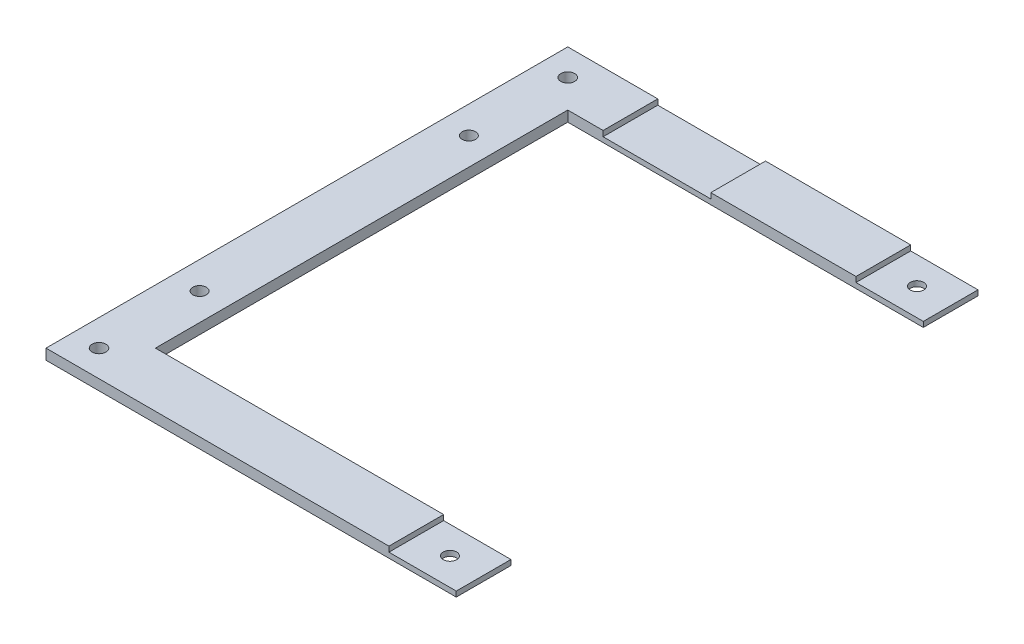
ISO-10303-21;
HEADER;
FILE_DESCRIPTION(('STEP AP214'),'2;1');
FILE_NAME('part.step','',(''),(''),'','','');
FILE_SCHEMA(('AUTOMOTIVE_DESIGN { 1 0 10303 214 1 1 1 1 }'));
ENDSEC;
DATA;
#1=APPLICATION_CONTEXT('core data for automotive mechanical design processes');
#2=APPLICATION_PROTOCOL_DEFINITION('international standard','automotive_design',2000,#1);
#3=PRODUCT_CONTEXT('',#1,'mechanical');
#4=PRODUCT('Part','Part','',(#3));
#5=PRODUCT_RELATED_PRODUCT_CATEGORY('part','',(#4));
#6=PRODUCT_DEFINITION_FORMATION('','',#4);
#7=PRODUCT_DEFINITION_CONTEXT('part definition',#1,'design');
#8=PRODUCT_DEFINITION('design','',#6,#7);
#9=PRODUCT_DEFINITION_SHAPE('','',#8);
#10=(LENGTH_UNIT() NAMED_UNIT(*) SI_UNIT(.MILLI.,.METRE.));
#11=(NAMED_UNIT(*) PLANE_ANGLE_UNIT() SI_UNIT($,.RADIAN.));
#12=(NAMED_UNIT(*) SI_UNIT($,.STERADIAN.) SOLID_ANGLE_UNIT());
#13=UNCERTAINTY_MEASURE_WITH_UNIT(LENGTH_MEASURE(1.E-05),#10,'distance_accuracy_value','');
#14=(GEOMETRIC_REPRESENTATION_CONTEXT(3) GLOBAL_UNCERTAINTY_ASSIGNED_CONTEXT((#13)) GLOBAL_UNIT_ASSIGNED_CONTEXT((#10,
#11,#12)) REPRESENTATION_CONTEXT('',''));
#15=CARTESIAN_POINT('',(0.,0.,0.));
#16=DIRECTION('',(0.,0.,1.));
#17=DIRECTION('',(1.,0.,0.));
#18=AXIS2_PLACEMENT_3D('',#15,#16,#17);
#19=CARTESIAN_POINT('',(-12.7,0.,-98.435));
#20=DIRECTION('',(-1.,0.,0.));
#21=DIRECTION('',(0.,-1.,0.));
#22=AXIS2_PLACEMENT_3D('',#19,#20,#21);
#23=PLANE('',#22);
#24=DIRECTION('',(0.,0.,1.));
#25=VECTOR('',#24,1.);
#26=CARTESIAN_POINT('',(-12.7,0.,0.));
#27=LINE('',#26,#25);
#28=CARTESIAN_POINT('',(-12.7,0.,77.7875));
#29=VERTEX_POINT('',#28);
#30=CARTESIAN_POINT('',(-12.7,0.,98.425));
#31=VERTEX_POINT('',#30);
#32=EDGE_CURVE('E238',#29,#31,#27,.T.);
#33=ORIENTED_EDGE('',*,*,#32,.T.);
#34=DIRECTION('',(0.,-1.,0.));
#35=VECTOR('',#34,1.);
#36=CARTESIAN_POINT('',(-12.7,-3.96875000000068,98.425));
#37=LINE('',#36,#35);
#38=CARTESIAN_POINT('',(-12.7,-1.984375,98.425));
#39=VERTEX_POINT('',#38);
#40=EDGE_CURVE('E253',#31,#39,#37,.T.);
#41=ORIENTED_EDGE('',*,*,#40,.T.);
#42=DIRECTION('',(0.,0.,1.));
#43=VECTOR('',#42,1.);
#44=CARTESIAN_POINT('',(-12.7,-1.984375,-98.435));
#45=LINE('',#44,#43);
#46=CARTESIAN_POINT('',(-12.7,-1.984375,77.7875));
#47=VERTEX_POINT('',#46);
#48=EDGE_CURVE('E255',#47,#39,#45,.T.);
#49=ORIENTED_EDGE('',*,*,#48,.F.);
#50=DIRECTION('',(0.,-1.,0.));
#51=VECTOR('',#50,1.);
#52=CARTESIAN_POINT('',(-12.7,-3.96875000000057,77.7875));
#53=LINE('',#52,#51);
#54=EDGE_CURVE('E246',#29,#47,#53,.T.);
#55=ORIENTED_EDGE('',*,*,#54,.F.);
#56=EDGE_LOOP('',(#33,#41,#49,#55));
#57=FACE_BOUND('',#56,.T.);
#58=ADVANCED_FACE('F34',(#57),#23,.F.);
#59=CARTESIAN_POINT('',(12.7,-1.984375,-98.435));
#60=DIRECTION('',(-1.,0.,0.));
#61=DIRECTION('',(0.,-1.,0.));
#62=AXIS2_PLACEMENT_3D('',#59,#60,#61);
#63=PLANE('',#62);
#64=DIRECTION('',(0.,0.,1.));
#65=VECTOR('',#64,1.);
#66=CARTESIAN_POINT('',(12.7,-1.984375,-98.435));
#67=LINE('',#66,#65);
#68=CARTESIAN_POINT('',(12.7,-1.984375,77.7875));
#69=VERTEX_POINT('',#68);
#70=CARTESIAN_POINT('',(12.7,-1.984375,98.425));
#71=VERTEX_POINT('',#70);
#72=EDGE_CURVE('E12',#69,#71,#67,.T.);
#73=ORIENTED_EDGE('',*,*,#72,.T.);
#74=DIRECTION('',(0.,-1.,0.));
#75=VECTOR('',#74,1.);
#76=CARTESIAN_POINT('',(12.7,-3.96875000000081,98.425));
#77=LINE('',#76,#75);
#78=CARTESIAN_POINT('',(12.6999999999999,-3.96875,98.425));
#79=VERTEX_POINT('',#78);
#80=EDGE_CURVE('E247',#71,#79,#77,.T.);
#81=ORIENTED_EDGE('',*,*,#80,.T.);
#82=DIRECTION('',(0.,0.,1.));
#83=VECTOR('',#82,1.);
#84=CARTESIAN_POINT('',(12.7,-3.96875,0.));
#85=LINE('',#84,#83);
#86=CARTESIAN_POINT('',(12.7,-3.96875,77.7875));
#87=VERTEX_POINT('',#86);
#88=EDGE_CURVE('E243',#87,#79,#85,.T.);
#89=ORIENTED_EDGE('',*,*,#88,.F.);
#90=DIRECTION('',(0.,-1.,0.));
#91=VECTOR('',#90,1.);
#92=CARTESIAN_POINT('',(12.7,-3.9687500000007,77.7875));
#93=LINE('',#92,#91);
#94=EDGE_CURVE('E237',#69,#87,#93,.T.);
#95=ORIENTED_EDGE('',*,*,#94,.F.);
#96=EDGE_LOOP('',(#73,#81,#89,#95));
#97=FACE_BOUND('',#96,.T.);
#98=ADVANCED_FACE('F286',(#97),#63,.F.);
#99=CARTESIAN_POINT('',(-12.7,-1.984375,-98.435));
#100=DIRECTION('',(0.,-1.,0.));
#101=DIRECTION('',(1.,0.,0.));
#102=AXIS2_PLACEMENT_3D('',#99,#100,#101);
#103=PLANE('',#102);
#104=CARTESIAN_POINT('',(0.,-1.984375,88.10625));
#105=DIRECTION('',(0.,-1.,0.));
#106=DIRECTION('',(1.,0.,0.));
#107=AXIS2_PLACEMENT_3D('',#104,#105,#106);
#108=CIRCLE('',#107,2.5273);
#109=CARTESIAN_POINT('',(2.52729999999998,-1.984375,88.10625));
#110=VERTEX_POINT('',#109);
#111=EDGE_CURVE('E232',#110,#110,#108,.F.);
#112=ORIENTED_EDGE('',*,*,#111,.F.);
#113=EDGE_LOOP('',(#112));
#114=FACE_BOUND('',#113,.T.);
#115=ORIENTED_EDGE('',*,*,#48,.T.);
#116=DIRECTION('',(1.,0.,0.));
#117=VECTOR('',#116,1.);
#118=CARTESIAN_POINT('',(-142.08125,-1.98437500000002,98.425));
#119=LINE('',#118,#117);
#120=EDGE_CURVE('E250',#39,#71,#119,.T.);
#121=ORIENTED_EDGE('',*,*,#120,.T.);
#122=ORIENTED_EDGE('',*,*,#72,.F.);
#123=DIRECTION('',(1.,0.,0.));
#124=VECTOR('',#123,1.);
#125=CARTESIAN_POINT('',(-121.44375,-1.98437500000001,77.7875));
#126=LINE('',#125,#124);
#127=EDGE_CURVE('E261',#47,#69,#126,.T.);
#128=ORIENTED_EDGE('',*,*,#127,.F.);
#129=EDGE_LOOP('',(#115,#121,#122,#128));
#130=FACE_BOUND('',#129,.T.);
#131=ADVANCED_FACE('F278',(#114,#130),#103,.F.);
#132=DIRECTION('',(-1.,0.,0.));
#133=VECTOR('',#132,1.);
#134=CARTESIAN_POINT('',(142.08125,-1.98437499999998,-98.425));
#135=LINE('',#134,#133);
#136=CARTESIAN_POINT('',(12.7,-1.984375,-98.425));
#137=VERTEX_POINT('',#136);
#138=CARTESIAN_POINT('',(-12.7,-1.984375,-98.425));
#139=VERTEX_POINT('',#138);
#140=EDGE_CURVE('E264',#137,#139,#135,.T.);
#141=ORIENTED_EDGE('',*,*,#140,.T.);
#142=CARTESIAN_POINT('',(-12.7,-1.984375,-77.7875));
#143=VERTEX_POINT('',#142);
#144=EDGE_CURVE('E241',#139,#143,#45,.T.);
#145=ORIENTED_EDGE('',*,*,#144,.T.);
#146=DIRECTION('',(-1.,0.,0.));
#147=VECTOR('',#146,1.);
#148=CARTESIAN_POINT('',(121.44375,-1.98437499999998,-77.7875));
#149=LINE('',#148,#147);
#150=CARTESIAN_POINT('',(12.7,-1.984375,-77.7875));
#151=VERTEX_POINT('',#150);
#152=EDGE_CURVE('E50',#151,#143,#149,.T.);
#153=ORIENTED_EDGE('',*,*,#152,.F.);
#154=EDGE_CURVE('E42',#137,#151,#67,.T.);
#155=ORIENTED_EDGE('',*,*,#154,.F.);
#156=EDGE_LOOP('',(#141,#145,#153,#155));
#157=FACE_BOUND('',#156,.T.);
#158=CARTESIAN_POINT('',(0.,-1.984375,-88.10625));
#159=DIRECTION('',(0.,-1.,0.));
#160=DIRECTION('',(1.,0.,0.));
#161=AXIS2_PLACEMENT_3D('',#158,#159,#160);
#162=CIRCLE('',#161,2.5273);
#163=CARTESIAN_POINT('',(2.52729999999996,-1.984375,-88.10625));
#164=VERTEX_POINT('',#163);
#165=EDGE_CURVE('E224',#164,#164,#162,.F.);
#166=ORIENTED_EDGE('',*,*,#165,.F.);
#167=EDGE_LOOP('',(#166));
#168=FACE_BOUND('',#167,.T.);
#169=ADVANCED_FACE('F377',(#157,#168),#103,.F.);
#170=DIRECTION('',(0.,1.,0.));
#171=VECTOR('',#170,1.);
#172=CARTESIAN_POINT('',(12.7,-3.96874999999932,-98.425));
#173=LINE('',#172,#171);
#174=CARTESIAN_POINT('',(12.7,-3.96875,-98.425));
#175=VERTEX_POINT('',#174);
#176=EDGE_CURVE('E266',#175,#137,#173,.T.);
#177=ORIENTED_EDGE('',*,*,#176,.T.);
#178=ORIENTED_EDGE('',*,*,#154,.T.);
#179=DIRECTION('',(0.,1.,0.));
#180=VECTOR('',#179,1.);
#181=CARTESIAN_POINT('',(12.7,-3.96874999999943,-77.7875));
#182=LINE('',#181,#180);
#183=CARTESIAN_POINT('',(12.7,-3.96875,-77.7875));
#184=VERTEX_POINT('',#183);
#185=EDGE_CURVE('E233',#184,#151,#182,.T.);
#186=ORIENTED_EDGE('',*,*,#185,.F.);
#187=EDGE_CURVE('E245',#175,#184,#85,.T.);
#188=ORIENTED_EDGE('',*,*,#187,.F.);
#189=EDGE_LOOP('',(#177,#178,#186,#188));
#190=FACE_BOUND('',#189,.T.);
#191=ADVANCED_FACE('F310',(#190),#63,.F.);
#192=DIRECTION('',(0.,1.,0.));
#193=VECTOR('',#192,1.);
#194=CARTESIAN_POINT('',(-12.7,-3.96874999999919,-98.425));
#195=LINE('',#194,#193);
#196=CARTESIAN_POINT('',(-12.6999999999999,0.,-98.425));
#197=VERTEX_POINT('',#196);
#198=EDGE_CURVE('E37',#139,#197,#195,.T.);
#199=ORIENTED_EDGE('',*,*,#198,.T.);
#200=CARTESIAN_POINT('',(-12.7,0.,-77.7875));
#201=VERTEX_POINT('',#200);
#202=EDGE_CURVE('E242',#197,#201,#27,.T.);
#203=ORIENTED_EDGE('',*,*,#202,.T.);
#204=DIRECTION('',(0.,1.,0.));
#205=VECTOR('',#204,1.);
#206=CARTESIAN_POINT('',(-12.7,-3.9687499999993,-77.7875));
#207=LINE('',#206,#205);
#208=EDGE_CURVE('E235',#143,#201,#207,.T.);
#209=ORIENTED_EDGE('',*,*,#208,.F.);
#210=ORIENTED_EDGE('',*,*,#144,.F.);
#211=EDGE_LOOP('',(#199,#203,#209,#210));
#212=FACE_BOUND('',#211,.T.);
#213=ADVANCED_FACE('F363',(#212),#23,.F.);
#214=CARTESIAN_POINT('',(-131.7625,0.,-50.8));
#215=DIRECTION('',(0.,1.,0.));
#216=DIRECTION('',(0.,0.,1.));
#217=AXIS2_PLACEMENT_3D('',#214,#215,#216);
#218=CYLINDRICAL_SURFACE('',#217,2.52730000000001);
#219=CARTESIAN_POINT('',(-131.7625,-3.96875,-50.8));
#220=DIRECTION('',(0.,1.,0.));
#221=DIRECTION('',(0.,0.,1.));
#222=AXIS2_PLACEMENT_3D('',#219,#220,#221);
#223=CIRCLE('',#222,2.52730000000001);
#224=CARTESIAN_POINT('',(-131.7625,-3.96875,-48.2727));
#225=VERTEX_POINT('',#224);
#226=EDGE_CURVE('E166',#225,#225,#223,.T.);
#227=ORIENTED_EDGE('',*,*,#226,.F.);
#228=EDGE_LOOP('',(#227));
#229=FACE_BOUND('',#228,.T.);
#230=CARTESIAN_POINT('',(-131.7625,0.,-50.8));
#231=DIRECTION('',(0.,1.,0.));
#232=DIRECTION('',(0.,0.,1.));
#233=AXIS2_PLACEMENT_3D('',#230,#231,#232);
#234=CIRCLE('',#233,2.52730000000001);
#235=CARTESIAN_POINT('',(-131.7625,0.,-48.2727));
#236=VERTEX_POINT('',#235);
#237=EDGE_CURVE('E324',#236,#236,#234,.T.);
#238=ORIENTED_EDGE('',*,*,#237,.T.);
#239=EDGE_LOOP('',(#238));
#240=FACE_BOUND('',#239,.T.);
#241=ADVANCED_FACE('F369',(#229,#240),#218,.F.);
#242=CARTESIAN_POINT('',(-131.7625,0.,50.8));
#243=DIRECTION('',(0.,1.,0.));
#244=DIRECTION('',(0.,0.,1.));
#245=AXIS2_PLACEMENT_3D('',#242,#243,#244);
#246=CYLINDRICAL_SURFACE('',#245,2.52730000000001);
#247=CARTESIAN_POINT('',(-131.7625,-3.96875,50.8));
#248=DIRECTION('',(0.,1.,0.));
#249=DIRECTION('',(0.,0.,1.));
#250=AXIS2_PLACEMENT_3D('',#247,#248,#249);
#251=CIRCLE('',#250,2.52730000000001);
#252=CARTESIAN_POINT('',(-131.7625,-3.96875,53.3273));
#253=VERTEX_POINT('',#252);
#254=EDGE_CURVE('E327',#253,#253,#251,.T.);
#255=ORIENTED_EDGE('',*,*,#254,.F.);
#256=EDGE_LOOP('',(#255));
#257=FACE_BOUND('',#256,.T.);
#258=CARTESIAN_POINT('',(-131.7625,0.,50.8));
#259=DIRECTION('',(0.,1.,0.));
#260=DIRECTION('',(0.,0.,1.));
#261=AXIS2_PLACEMENT_3D('',#258,#259,#260);
#262=CIRCLE('',#261,2.52730000000001);
#263=CARTESIAN_POINT('',(-131.7625,0.,53.3273));
#264=VERTEX_POINT('',#263);
#265=EDGE_CURVE('E330',#264,#264,#262,.T.);
#266=ORIENTED_EDGE('',*,*,#265,.T.);
#267=EDGE_LOOP('',(#266));
#268=FACE_BOUND('',#267,.T.);
#269=ADVANCED_FACE('F359',(#257,#268),#246,.F.);
#270=CARTESIAN_POINT('',(-132.08125,4.4196,88.425));
#271=DIRECTION('',(0.,1.,0.));
#272=DIRECTION('',(0.,0.,1.));
#273=AXIS2_PLACEMENT_3D('',#270,#271,#272);
#274=CYLINDRICAL_SURFACE('',#273,2.60985);
#275=CARTESIAN_POINT('',(-132.08125,0.,88.425));
#276=DIRECTION('',(0.,1.,0.));
#277=DIRECTION('',(0.,0.,1.));
#278=AXIS2_PLACEMENT_3D('',#275,#276,#277);
#279=CIRCLE('',#278,2.60985);
#280=CARTESIAN_POINT('',(-132.08125,0.,91.03485));
#281=VERTEX_POINT('',#280);
#282=EDGE_CURVE('E339',#281,#281,#279,.T.);
#283=ORIENTED_EDGE('',*,*,#282,.T.);
#284=EDGE_LOOP('',(#283));
#285=FACE_BOUND('',#284,.T.);
#286=CARTESIAN_POINT('',(-132.08125,-3.96875,88.425));
#287=DIRECTION('',(0.,1.,0.));
#288=DIRECTION('',(0.,0.,1.));
#289=AXIS2_PLACEMENT_3D('',#286,#287,#288);
#290=CIRCLE('',#289,2.60985);
#291=CARTESIAN_POINT('',(-132.08125,-3.96875,91.03485));
#292=VERTEX_POINT('',#291);
#293=EDGE_CURVE('E228',#292,#292,#290,.T.);
#294=ORIENTED_EDGE('',*,*,#293,.F.);
#295=EDGE_LOOP('',(#294));
#296=FACE_BOUND('',#295,.T.);
#297=ADVANCED_FACE('F351',(#285,#296),#274,.F.);
#298=CARTESIAN_POINT('',(-132.08125,4.4196,-88.425));
#299=DIRECTION('',(0.,1.,0.));
#300=DIRECTION('',(0.,0.,1.));
#301=AXIS2_PLACEMENT_3D('',#298,#299,#300);
#302=CYLINDRICAL_SURFACE('',#301,2.60985);
#303=CARTESIAN_POINT('',(-132.08125,0.,-88.425));
#304=DIRECTION('',(0.,1.,0.));
#305=DIRECTION('',(0.,0.,1.));
#306=AXIS2_PLACEMENT_3D('',#303,#304,#305);
#307=CIRCLE('',#306,2.60985);
#308=CARTESIAN_POINT('',(-132.08125,0.,-85.81515));
#309=VERTEX_POINT('',#308);
#310=EDGE_CURVE('E225',#309,#309,#307,.T.);
#311=ORIENTED_EDGE('',*,*,#310,.T.);
#312=EDGE_LOOP('',(#311));
#313=FACE_BOUND('',#312,.T.);
#314=CARTESIAN_POINT('',(-132.08125,-3.96875,-88.425));
#315=DIRECTION('',(0.,1.,0.));
#316=DIRECTION('',(0.,0.,1.));
#317=AXIS2_PLACEMENT_3D('',#314,#315,#316);
#318=CIRCLE('',#317,2.60985);
#319=CARTESIAN_POINT('',(-132.08125,-3.96875,-85.81515));
#320=VERTEX_POINT('',#319);
#321=EDGE_CURVE('E229',#320,#320,#318,.T.);
#322=ORIENTED_EDGE('',*,*,#321,.F.);
#323=EDGE_LOOP('',(#322));
#324=FACE_BOUND('',#323,.T.);
#325=ADVANCED_FACE('F349',(#313,#324),#302,.F.);
#326=CARTESIAN_POINT('',(-142.08125,-3.96875,98.425));
#327=DIRECTION('',(0.,0.,1.));
#328=DIRECTION('',(1.,0.,0.));
#329=AXIS2_PLACEMENT_3D('',#326,#327,#328);
#330=PLANE('',#329);
#331=ORIENTED_EDGE('',*,*,#40,.F.);
#332=DIRECTION('',(1.,0.,0.));
#333=VECTOR('',#332,1.);
#334=CARTESIAN_POINT('',(-142.08125,0.,98.425));
#335=LINE('',#334,#333);
#336=CARTESIAN_POINT('',(-142.08125,0.,98.425));
#337=VERTEX_POINT('',#336);
#338=EDGE_CURVE('E202',#337,#31,#335,.T.);
#339=ORIENTED_EDGE('',*,*,#338,.F.);
#340=DIRECTION('',(0.,1.,0.));
#341=VECTOR('',#340,1.);
#342=CARTESIAN_POINT('',(-142.08125,-3.96875,98.425));
#343=LINE('',#342,#341);
#344=CARTESIAN_POINT('',(-142.08125,-3.96875,98.425));
#345=VERTEX_POINT('',#344);
#346=EDGE_CURVE('E216',#345,#337,#343,.T.);
#347=ORIENTED_EDGE('',*,*,#346,.F.);
#348=DIRECTION('',(1.,0.,0.));
#349=VECTOR('',#348,1.);
#350=CARTESIAN_POINT('',(-142.08125,-3.96875,98.425));
#351=LINE('',#350,#349);
#352=EDGE_CURVE('E205',#345,#79,#351,.T.);
#353=ORIENTED_EDGE('',*,*,#352,.T.);
#354=ORIENTED_EDGE('',*,*,#80,.F.);
#355=ORIENTED_EDGE('',*,*,#120,.F.);
#356=EDGE_LOOP('',(#331,#339,#347,#353,#354,#355));
#357=FACE_BOUND('',#356,.T.);
#358=ADVANCED_FACE('F282',(#357),#330,.T.);
#359=CARTESIAN_POINT('',(-142.08125,-3.96875,-98.4249999999999));
#360=DIRECTION('',(-1.,0.,0.));
#361=DIRECTION('',(0.,0.,1.));
#362=AXIS2_PLACEMENT_3D('',#359,#360,#361);
#363=PLANE('',#362);
#364=DIRECTION('',(0.,0.,1.));
#365=VECTOR('',#364,1.);
#366=CARTESIAN_POINT('',(-142.08125,0.,-98.4249999999999));
#367=LINE('',#366,#365);
#368=CARTESIAN_POINT('',(-142.08125,0.,-98.4249999999999));
#369=VERTEX_POINT('',#368);
#370=EDGE_CURVE('E211',#369,#337,#367,.T.);
#371=ORIENTED_EDGE('',*,*,#370,.F.);
#372=DIRECTION('',(0.,1.,0.));
#373=VECTOR('',#372,1.);
#374=CARTESIAN_POINT('',(-142.08125,-3.96875,-98.4249999999999));
#375=LINE('',#374,#373);
#376=CARTESIAN_POINT('',(-142.08125,-3.96875,-98.4249999999999));
#377=VERTEX_POINT('',#376);
#378=EDGE_CURVE('E208',#377,#369,#375,.T.);
#379=ORIENTED_EDGE('',*,*,#378,.F.);
#380=DIRECTION('',(0.,0.,1.));
#381=VECTOR('',#380,1.);
#382=CARTESIAN_POINT('',(-142.08125,-3.96875,-98.4249999999999));
#383=LINE('',#382,#381);
#384=EDGE_CURVE('E201',#377,#345,#383,.T.);
#385=ORIENTED_EDGE('',*,*,#384,.T.);
#386=ORIENTED_EDGE('',*,*,#346,.T.);
#387=EDGE_LOOP('',(#371,#379,#385,#386));
#388=FACE_BOUND('',#387,.T.);
#389=ADVANCED_FACE('F305',(#388),#363,.T.);
#390=CARTESIAN_POINT('',(142.08125,-3.96875,-98.425));
#391=DIRECTION('',(0.,0.,-1.));
#392=DIRECTION('',(-1.,0.,0.));
#393=AXIS2_PLACEMENT_3D('',#390,#391,#392);
#394=PLANE('',#393);
#395=ORIENTED_EDGE('',*,*,#198,.F.);
#396=ORIENTED_EDGE('',*,*,#140,.F.);
#397=ORIENTED_EDGE('',*,*,#176,.F.);
#398=DIRECTION('',(-1.,0.,0.));
#399=VECTOR('',#398,1.);
#400=CARTESIAN_POINT('',(142.08125,-3.96875,-98.425));
#401=LINE('',#400,#399);
#402=EDGE_CURVE('E199',#175,#377,#401,.T.);
#403=ORIENTED_EDGE('',*,*,#402,.T.);
#404=ORIENTED_EDGE('',*,*,#378,.T.);
#405=DIRECTION('',(-1.,0.,0.));
#406=VECTOR('',#405,1.);
#407=CARTESIAN_POINT('',(142.08125,0.,-98.425));
#408=LINE('',#407,#406);
#409=CARTESIAN_POINT('',(-108.10875,0.,-98.425));
#410=VERTEX_POINT('',#409);
#411=EDGE_CURVE('E196',#410,#369,#408,.T.);
#412=ORIENTED_EDGE('',*,*,#411,.F.);
#413=DIRECTION('',(0.,1.,0.));
#414=VECTOR('',#413,1.);
#415=CARTESIAN_POINT('',(-108.10875,-3.96875,-98.4249999999999));
#416=LINE('',#415,#414);
#417=CARTESIAN_POINT('',(-108.10875,-2.06375,-98.425));
#418=VERTEX_POINT('',#417);
#419=EDGE_CURVE('E165',#418,#410,#416,.T.);
#420=ORIENTED_EDGE('',*,*,#419,.F.);
#421=DIRECTION('',(1.,0.,0.));
#422=VECTOR('',#421,1.);
#423=CARTESIAN_POINT('',(-67.46875,-2.06375,-98.425));
#424=LINE('',#423,#422);
#425=CARTESIAN_POINT('',(-67.46875,-2.06375,-98.425));
#426=VERTEX_POINT('',#425);
#427=EDGE_CURVE('E149',#418,#426,#424,.T.);
#428=ORIENTED_EDGE('',*,*,#427,.T.);
#429=DIRECTION('',(0.,-1.,0.));
#430=VECTOR('',#429,1.);
#431=CARTESIAN_POINT('',(-67.46875,-3.96875,-98.425));
#432=LINE('',#431,#430);
#433=CARTESIAN_POINT('',(-67.46875,0.,-98.425));
#434=VERTEX_POINT('',#433);
#435=EDGE_CURVE('E163',#434,#426,#432,.T.);
#436=ORIENTED_EDGE('',*,*,#435,.F.);
#437=EDGE_CURVE('E209',#197,#434,#408,.T.);
#438=ORIENTED_EDGE('',*,*,#437,.F.);
#439=EDGE_LOOP('',(#395,#396,#397,#403,#404,#412,#420,#428,#436,#438));
#440=FACE_BOUND('',#439,.T.);
#441=ADVANCED_FACE('F161',(#440),#394,.T.);
#442=CARTESIAN_POINT('',(0.,-3.96875,0.));
#443=DIRECTION('',(0.,1.,0.));
#444=DIRECTION('',(0.,0.,1.));
#445=AXIS2_PLACEMENT_3D('',#442,#443,#444);
#446=PLANE('',#445);
#447=ORIENTED_EDGE('',*,*,#321,.T.);
#448=EDGE_LOOP('',(#447));
#449=FACE_BOUND('',#448,.T.);
#450=ORIENTED_EDGE('',*,*,#293,.T.);
#451=EDGE_LOOP('',(#450));
#452=FACE_BOUND('',#451,.T.);
#453=CARTESIAN_POINT('',(0.,-3.96875,-88.10625));
#454=DIRECTION('',(0.,1.,0.));
#455=DIRECTION('',(0.,0.,1.));
#456=AXIS2_PLACEMENT_3D('',#453,#454,#455);
#457=CIRCLE('',#456,2.5273);
#458=CARTESIAN_POINT('',(0.,-3.96875,-85.57895));
#459=VERTEX_POINT('',#458);
#460=EDGE_CURVE('E336',#459,#459,#457,.T.);
#461=ORIENTED_EDGE('',*,*,#460,.T.);
#462=EDGE_LOOP('',(#461));
#463=FACE_BOUND('',#462,.T.);
#464=CARTESIAN_POINT('',(0.,-3.96875,88.10625));
#465=DIRECTION('',(0.,1.,0.));
#466=DIRECTION('',(0.,0.,1.));
#467=AXIS2_PLACEMENT_3D('',#464,#465,#466);
#468=CIRCLE('',#467,2.5273);
#469=CARTESIAN_POINT('',(0.,-3.96875,90.63355));
#470=VERTEX_POINT('',#469);
#471=EDGE_CURVE('E333',#470,#470,#468,.T.);
#472=ORIENTED_EDGE('',*,*,#471,.T.);
#473=EDGE_LOOP('',(#472));
#474=FACE_BOUND('',#473,.T.);
#475=ORIENTED_EDGE('',*,*,#254,.T.);
#476=EDGE_LOOP('',(#475));
#477=FACE_BOUND('',#476,.T.);
#478=ORIENTED_EDGE('',*,*,#226,.T.);
#479=EDGE_LOOP('',(#478));
#480=FACE_BOUND('',#479,.T.);
#481=ORIENTED_EDGE('',*,*,#402,.F.);
#482=ORIENTED_EDGE('',*,*,#187,.T.);
#483=DIRECTION('',(-1.,0.,0.));
#484=VECTOR('',#483,1.);
#485=CARTESIAN_POINT('',(121.44375,-3.96875,-77.7875));
#486=LINE('',#485,#484);
#487=CARTESIAN_POINT('',(-121.44375,-3.96875,-77.7875));
#488=VERTEX_POINT('',#487);
#489=EDGE_CURVE('E183',#184,#488,#486,.T.);
#490=ORIENTED_EDGE('',*,*,#489,.T.);
#491=DIRECTION('',(0.,0.,1.));
#492=VECTOR('',#491,1.);
#493=CARTESIAN_POINT('',(-121.44375,-3.96875,-77.7875));
#494=LINE('',#493,#492);
#495=CARTESIAN_POINT('',(-121.44375,-3.96875,77.7875));
#496=VERTEX_POINT('',#495);
#497=EDGE_CURVE('E186',#488,#496,#494,.T.);
#498=ORIENTED_EDGE('',*,*,#497,.T.);
#499=DIRECTION('',(1.,0.,0.));
#500=VECTOR('',#499,1.);
#501=CARTESIAN_POINT('',(-121.44375,-3.96875,77.7875));
#502=LINE('',#501,#500);
#503=EDGE_CURVE('E180',#496,#87,#502,.T.);
#504=ORIENTED_EDGE('',*,*,#503,.T.);
#505=ORIENTED_EDGE('',*,*,#88,.T.);
#506=ORIENTED_EDGE('',*,*,#352,.F.);
#507=ORIENTED_EDGE('',*,*,#384,.F.);
#508=EDGE_LOOP('',(#481,#482,#490,#498,#504,#505,#506,#507));
#509=FACE_BOUND('',#508,.T.);
#510=ADVANCED_FACE('F291',(#449,#452,#463,#474,#477,#480,#509),#446,.F.);
#511=CARTESIAN_POINT('',(0.,0.,-88.10625));
#512=DIRECTION('',(0.,1.,0.));
#513=DIRECTION('',(0.,0.,1.));
#514=AXIS2_PLACEMENT_3D('',#511,#512,#513);
#515=CYLINDRICAL_SURFACE('',#514,2.5273);
#516=ORIENTED_EDGE('',*,*,#165,.T.);
#517=EDGE_LOOP('',(#516));
#518=FACE_BOUND('',#517,.T.);
#519=ORIENTED_EDGE('',*,*,#460,.F.);
#520=EDGE_LOOP('',(#519));
#521=FACE_BOUND('',#520,.T.);
#522=ADVANCED_FACE('F390',(#518,#521),#515,.F.);
#523=CARTESIAN_POINT('',(0.,0.,88.10625));
#524=DIRECTION('',(0.,1.,0.));
#525=DIRECTION('',(0.,0.,1.));
#526=AXIS2_PLACEMENT_3D('',#523,#524,#525);
#527=CYLINDRICAL_SURFACE('',#526,2.5273);
#528=ORIENTED_EDGE('',*,*,#111,.T.);
#529=EDGE_LOOP('',(#528));
#530=FACE_BOUND('',#529,.T.);
#531=ORIENTED_EDGE('',*,*,#471,.F.);
#532=EDGE_LOOP('',(#531));
#533=FACE_BOUND('',#532,.T.);
#534=ADVANCED_FACE('F404',(#530,#533),#527,.F.);
#535=CARTESIAN_POINT('',(-121.44375,-3.96875,-77.7875));
#536=DIRECTION('',(-1.,0.,0.));
#537=DIRECTION('',(0.,0.,1.));
#538=AXIS2_PLACEMENT_3D('',#535,#536,#537);
#539=PLANE('',#538);
#540=DIRECTION('',(0.,0.,1.));
#541=VECTOR('',#540,1.);
#542=CARTESIAN_POINT('',(-121.44375,0.,-77.7875));
#543=LINE('',#542,#541);
#544=CARTESIAN_POINT('',(-121.44375,0.,-77.7875));
#545=VERTEX_POINT('',#544);
#546=CARTESIAN_POINT('',(-121.44375,0.,77.7875));
#547=VERTEX_POINT('',#546);
#548=EDGE_CURVE('E184',#545,#547,#543,.T.);
#549=ORIENTED_EDGE('',*,*,#548,.T.);
#550=DIRECTION('',(0.,1.,0.));
#551=VECTOR('',#550,1.);
#552=CARTESIAN_POINT('',(-121.44375,-3.96875,77.7875));
#553=LINE('',#552,#551);
#554=EDGE_CURVE('E194',#496,#547,#553,.T.);
#555=ORIENTED_EDGE('',*,*,#554,.F.);
#556=ORIENTED_EDGE('',*,*,#497,.F.);
#557=DIRECTION('',(0.,1.,0.));
#558=VECTOR('',#557,1.);
#559=CARTESIAN_POINT('',(-121.44375,-3.96875,-77.7875));
#560=LINE('',#559,#558);
#561=EDGE_CURVE('E188',#488,#545,#560,.T.);
#562=ORIENTED_EDGE('',*,*,#561,.T.);
#563=EDGE_LOOP('',(#549,#555,#556,#562));
#564=FACE_BOUND('',#563,.T.);
#565=ADVANCED_FACE('F295',(#564),#539,.F.);
#566=CARTESIAN_POINT('',(0.,0.,0.));
#567=DIRECTION('',(0.,1.,0.));
#568=DIRECTION('',(0.,0.,1.));
#569=AXIS2_PLACEMENT_3D('',#566,#567,#568);
#570=PLANE('',#569);
#571=ORIENTED_EDGE('',*,*,#32,.F.);
#572=DIRECTION('',(1.,0.,0.));
#573=VECTOR('',#572,1.);
#574=CARTESIAN_POINT('',(-121.44375,0.,77.7875));
#575=LINE('',#574,#573);
#576=EDGE_CURVE('E172',#547,#29,#575,.T.);
#577=ORIENTED_EDGE('',*,*,#576,.F.);
#578=ORIENTED_EDGE('',*,*,#548,.F.);
#579=DIRECTION('',(-1.,0.,0.));
#580=VECTOR('',#579,1.);
#581=CARTESIAN_POINT('',(121.44375,0.,-77.7875));
#582=LINE('',#581,#580);
#583=CARTESIAN_POINT('',(-108.10875,0.,-77.7875));
#584=VERTEX_POINT('',#583);
#585=EDGE_CURVE('E175',#584,#545,#582,.T.);
#586=ORIENTED_EDGE('',*,*,#585,.F.);
#587=DIRECTION('',(0.,0.,1.));
#588=VECTOR('',#587,1.);
#589=CARTESIAN_POINT('',(-108.10875,0.,-68.2625));
#590=LINE('',#589,#588);
#591=EDGE_CURVE('E315',#410,#584,#590,.T.);
#592=ORIENTED_EDGE('',*,*,#591,.F.);
#593=ORIENTED_EDGE('',*,*,#411,.T.);
#594=ORIENTED_EDGE('',*,*,#370,.T.);
#595=ORIENTED_EDGE('',*,*,#338,.T.);
#596=EDGE_LOOP('',(#571,#577,#578,#586,#592,#593,#594,#595));
#597=FACE_BOUND('',#596,.T.);
#598=ORIENTED_EDGE('',*,*,#310,.F.);
#599=EDGE_LOOP('',(#598));
#600=FACE_BOUND('',#599,.T.);
#601=ORIENTED_EDGE('',*,*,#282,.F.);
#602=EDGE_LOOP('',(#601));
#603=FACE_BOUND('',#602,.T.);
#604=ORIENTED_EDGE('',*,*,#265,.F.);
#605=EDGE_LOOP('',(#604));
#606=FACE_BOUND('',#605,.T.);
#607=ORIENTED_EDGE('',*,*,#237,.F.);
#608=EDGE_LOOP('',(#607));
#609=FACE_BOUND('',#608,.T.);
#610=ADVANCED_FACE('F299',(#597,#600,#603,#606,#609),#570,.T.);
#611=CARTESIAN_POINT('',(-108.10875,91.4422048345292,-68.2625));
#612=DIRECTION('',(-1.,0.,0.));
#613=DIRECTION('',(0.,0.,1.));
#614=AXIS2_PLACEMENT_3D('',#611,#612,#613);
#615=PLANE('',#614);
#616=DIRECTION('',(0.,1.,0.));
#617=VECTOR('',#616,1.);
#618=CARTESIAN_POINT('',(-108.10875,-3.96875,-77.7875));
#619=LINE('',#618,#617);
#620=CARTESIAN_POINT('',(-108.10875,-2.06375,-77.7875));
#621=VERTEX_POINT('',#620);
#622=EDGE_CURVE('E218',#621,#584,#619,.T.);
#623=ORIENTED_EDGE('',*,*,#622,.F.);
#624=DIRECTION('',(0.,0.,-1.));
#625=VECTOR('',#624,1.);
#626=CARTESIAN_POINT('',(-108.10875,-2.06375,-98.425));
#627=LINE('',#626,#625);
#628=EDGE_CURVE('E317',#621,#418,#627,.T.);
#629=ORIENTED_EDGE('',*,*,#628,.T.);
#630=ORIENTED_EDGE('',*,*,#419,.T.);
#631=ORIENTED_EDGE('',*,*,#591,.T.);
#632=EDGE_LOOP('',(#623,#629,#630,#631));
#633=FACE_BOUND('',#632,.T.);
#634=ADVANCED_FACE('F392',(#633),#615,.F.);
#635=CARTESIAN_POINT('',(0.,-2.06375,0.));
#636=DIRECTION('',(0.,1.,0.));
#637=DIRECTION('',(0.,0.,1.));
#638=AXIS2_PLACEMENT_3D('',#635,#636,#637);
#639=PLANE('',#638);
#640=ORIENTED_EDGE('',*,*,#427,.F.);
#641=ORIENTED_EDGE('',*,*,#628,.F.);
#642=DIRECTION('',(-1.,0.,0.));
#643=VECTOR('',#642,1.);
#644=CARTESIAN_POINT('',(-67.46875,-2.06375,-77.7875));
#645=LINE('',#644,#643);
#646=CARTESIAN_POINT('',(-67.46875,-2.06375,-77.7875));
#647=VERTEX_POINT('',#646);
#648=EDGE_CURVE('E151',#647,#621,#645,.T.);
#649=ORIENTED_EDGE('',*,*,#648,.F.);
#650=DIRECTION('',(0.,0.,1.));
#651=VECTOR('',#650,1.);
#652=CARTESIAN_POINT('',(-67.46875,-2.06375,-77.7875));
#653=LINE('',#652,#651);
#654=EDGE_CURVE('E145',#426,#647,#653,.T.);
#655=ORIENTED_EDGE('',*,*,#654,.F.);
#656=EDGE_LOOP('',(#640,#641,#649,#655));
#657=FACE_BOUND('',#656,.T.);
#658=ADVANCED_FACE('F147',(#657),#639,.T.);
#659=CARTESIAN_POINT('',(-67.46875,91.4422048345292,-68.2625));
#660=DIRECTION('',(1.,0.,0.));
#661=DIRECTION('',(0.,0.,-1.));
#662=AXIS2_PLACEMENT_3D('',#659,#660,#661);
#663=PLANE('',#662);
#664=ORIENTED_EDGE('',*,*,#435,.T.);
#665=ORIENTED_EDGE('',*,*,#654,.T.);
#666=DIRECTION('',(0.,-1.,0.));
#667=VECTOR('',#666,1.);
#668=CARTESIAN_POINT('',(-67.46875,-3.96875,-77.7875));
#669=LINE('',#668,#667);
#670=CARTESIAN_POINT('',(-67.46875,0.,-77.7875));
#671=VERTEX_POINT('',#670);
#672=EDGE_CURVE('E222',#671,#647,#669,.T.);
#673=ORIENTED_EDGE('',*,*,#672,.F.);
#674=DIRECTION('',(0.,0.,-1.));
#675=VECTOR('',#674,1.);
#676=CARTESIAN_POINT('',(-67.46875,0.,-68.2625));
#677=LINE('',#676,#675);
#678=EDGE_CURVE('E171',#671,#434,#677,.T.);
#679=ORIENTED_EDGE('',*,*,#678,.T.);
#680=EDGE_LOOP('',(#664,#665,#673,#679));
#681=FACE_BOUND('',#680,.T.);
#682=ADVANCED_FACE('F169',(#681),#663,.F.);
#683=ORIENTED_EDGE('',*,*,#202,.F.);
#684=ORIENTED_EDGE('',*,*,#437,.T.);
#685=ORIENTED_EDGE('',*,*,#678,.F.);
#686=EDGE_CURVE('E190',#201,#671,#582,.T.);
#687=ORIENTED_EDGE('',*,*,#686,.F.);
#688=EDGE_LOOP('',(#683,#684,#685,#687));
#689=FACE_BOUND('',#688,.T.);
#690=ADVANCED_FACE('F384',(#689),#570,.T.);
#691=CARTESIAN_POINT('',(121.44375,-3.96875,-77.7875));
#692=DIRECTION('',(0.,0.,-1.));
#693=DIRECTION('',(-1.,0.,0.));
#694=AXIS2_PLACEMENT_3D('',#691,#692,#693);
#695=PLANE('',#694);
#696=ORIENTED_EDGE('',*,*,#152,.T.);
#697=ORIENTED_EDGE('',*,*,#208,.T.);
#698=ORIENTED_EDGE('',*,*,#686,.T.);
#699=ORIENTED_EDGE('',*,*,#672,.T.);
#700=ORIENTED_EDGE('',*,*,#648,.T.);
#701=ORIENTED_EDGE('',*,*,#622,.T.);
#702=ORIENTED_EDGE('',*,*,#585,.T.);
#703=ORIENTED_EDGE('',*,*,#561,.F.);
#704=ORIENTED_EDGE('',*,*,#489,.F.);
#705=ORIENTED_EDGE('',*,*,#185,.T.);
#706=EDGE_LOOP('',(#696,#697,#698,#699,#700,#701,#702,#703,#704,#705));
#707=FACE_BOUND('',#706,.T.);
#708=ADVANCED_FACE('F311',(#707),#695,.F.);
#709=CARTESIAN_POINT('',(-121.44375,-3.96875,77.7875));
#710=DIRECTION('',(0.,0.,1.));
#711=DIRECTION('',(1.,0.,0.));
#712=AXIS2_PLACEMENT_3D('',#709,#710,#711);
#713=PLANE('',#712);
#714=ORIENTED_EDGE('',*,*,#576,.T.);
#715=ORIENTED_EDGE('',*,*,#54,.T.);
#716=ORIENTED_EDGE('',*,*,#127,.T.);
#717=ORIENTED_EDGE('',*,*,#94,.T.);
#718=ORIENTED_EDGE('',*,*,#503,.F.);
#719=ORIENTED_EDGE('',*,*,#554,.T.);
#720=EDGE_LOOP('',(#714,#715,#716,#717,#718,#719));
#721=FACE_BOUND('',#720,.T.);
#722=ADVANCED_FACE('F271',(#721),#713,.F.);
#723=CLOSED_SHELL('',(#58,#98,#131,#169,#191,#213,#241,#269,#297,#325,#358,#389,#441,#510,#522,
#534,#565,#610,#634,#658,#682,#690,#708,#722));
#724=MANIFOLD_SOLID_BREP('B2',#723);
#725=ADVANCED_BREP_SHAPE_REPRESENTATION('',(#18,#724),#14);
#726=SHAPE_DEFINITION_REPRESENTATION(#9,#725);
ENDSEC;
END-ISO-10303-21;
